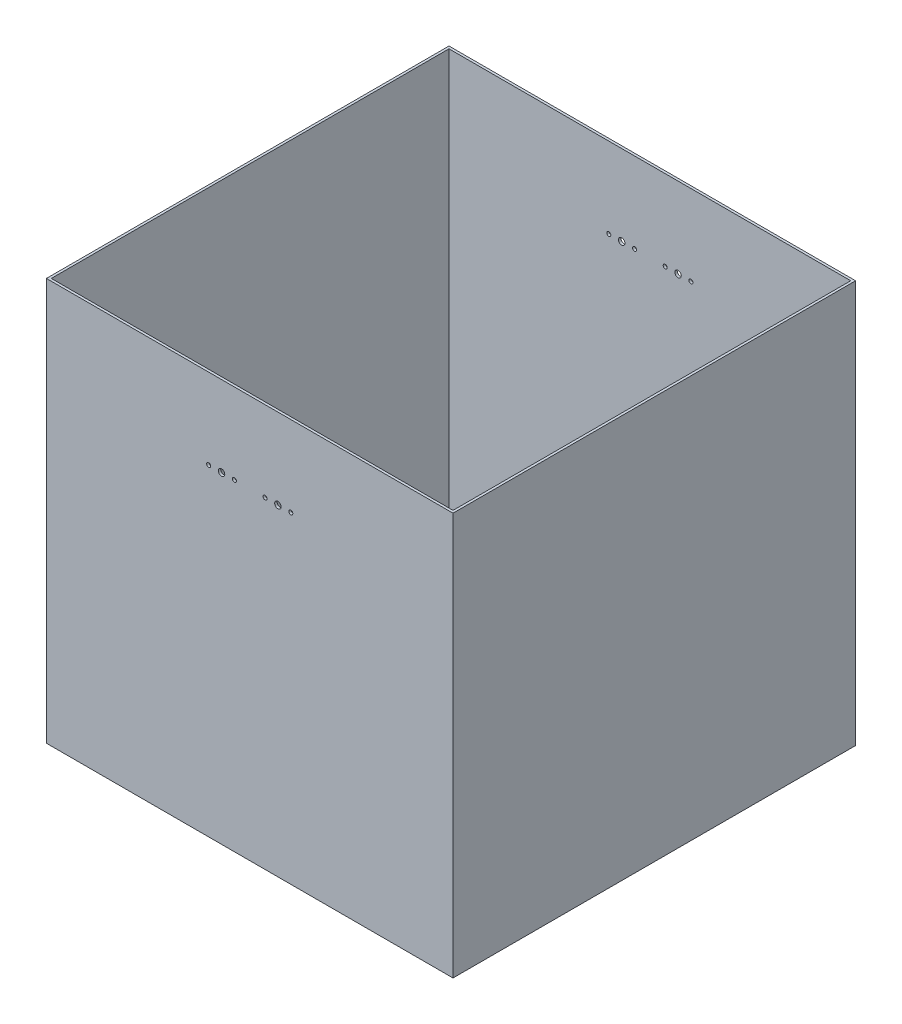
ISO-10303-21;
HEADER;
FILE_DESCRIPTION(('STEP AP214'),'2;1');
FILE_NAME('part.step','',(''),(''),'','','');
FILE_SCHEMA(('AUTOMOTIVE_DESIGN { 1 0 10303 214 1 1 1 1 }'));
ENDSEC;
DATA;
#1=APPLICATION_CONTEXT('core data for automotive mechanical design processes');
#2=APPLICATION_PROTOCOL_DEFINITION('international standard','automotive_design',2000,#1);
#3=PRODUCT_CONTEXT('',#1,'mechanical');
#4=PRODUCT('Part','Part','',(#3));
#5=PRODUCT_RELATED_PRODUCT_CATEGORY('part','',(#4));
#6=PRODUCT_DEFINITION_FORMATION('','',#4);
#7=PRODUCT_DEFINITION_CONTEXT('part definition',#1,'design');
#8=PRODUCT_DEFINITION('design','',#6,#7);
#9=PRODUCT_DEFINITION_SHAPE('','',#8);
#10=(LENGTH_UNIT() NAMED_UNIT(*) SI_UNIT(.MILLI.,.METRE.));
#11=(NAMED_UNIT(*) PLANE_ANGLE_UNIT() SI_UNIT($,.RADIAN.));
#12=(NAMED_UNIT(*) SI_UNIT($,.STERADIAN.) SOLID_ANGLE_UNIT());
#13=UNCERTAINTY_MEASURE_WITH_UNIT(LENGTH_MEASURE(1.E-05),#10,'distance_accuracy_value','');
#14=(GEOMETRIC_REPRESENTATION_CONTEXT(3) GLOBAL_UNCERTAINTY_ASSIGNED_CONTEXT((#13)) GLOBAL_UNIT_ASSIGNED_CONTEXT((#10,
#11,#12)) REPRESENTATION_CONTEXT('',''));
#15=CARTESIAN_POINT('',(0.,0.,0.));
#16=DIRECTION('',(0.,0.,1.));
#17=DIRECTION('',(1.,0.,0.));
#18=AXIS2_PLACEMENT_3D('',#15,#16,#17);
#19=CARTESIAN_POINT('',(0.,500.,0.));
#20=DIRECTION('',(0.,1.,0.));
#21=DIRECTION('',(0.,0.,1.));
#22=AXIS2_PLACEMENT_3D('',#19,#20,#21);
#23=PLANE('',#22);
#24=DIRECTION('',(0.,0.,-1.));
#25=VECTOR('',#24,1.);
#26=CARTESIAN_POINT('',(252.5,500.,-250.));
#27=LINE('',#26,#25);
#28=CARTESIAN_POINT('',(252.5,500.,250.));
#29=VERTEX_POINT('',#28);
#30=CARTESIAN_POINT('',(252.5,500.,-250.));
#31=VERTEX_POINT('',#30);
#32=EDGE_CURVE('E157',#29,#31,#27,.T.);
#33=ORIENTED_EDGE('',*,*,#32,.T.);
#34=DIRECTION('',(-1.,0.,0.));
#35=VECTOR('',#34,1.);
#36=CARTESIAN_POINT('',(-252.5,500.,-250.));
#37=LINE('',#36,#35);
#38=CARTESIAN_POINT('',(-252.5,500.,-250.));
#39=VERTEX_POINT('',#38);
#40=EDGE_CURVE('E161',#31,#39,#37,.T.);
#41=ORIENTED_EDGE('',*,*,#40,.T.);
#42=DIRECTION('',(0.,0.,1.));
#43=VECTOR('',#42,1.);
#44=CARTESIAN_POINT('',(-252.5,500.,-250.));
#45=LINE('',#44,#43);
#46=CARTESIAN_POINT('',(-252.5,500.,250.));
#47=VERTEX_POINT('',#46);
#48=EDGE_CURVE('E165',#39,#47,#45,.T.);
#49=ORIENTED_EDGE('',*,*,#48,.T.);
#50=DIRECTION('',(1.,0.,0.));
#51=VECTOR('',#50,1.);
#52=CARTESIAN_POINT('',(-252.5,500.,250.));
#53=LINE('',#52,#51);
#54=EDGE_CURVE('E168',#47,#29,#53,.T.);
#55=ORIENTED_EDGE('',*,*,#54,.T.);
#56=EDGE_LOOP('',(#33,#41,#49,#55));
#57=FACE_BOUND('',#56,.T.);
#58=DIRECTION('',(1.,0.,0.));
#59=VECTOR('',#58,1.);
#60=CARTESIAN_POINT('',(-249.5,500.,247.));
#61=LINE('',#60,#59);
#62=CARTESIAN_POINT('',(-249.5,500.,247.));
#63=VERTEX_POINT('',#62);
#64=CARTESIAN_POINT('',(249.5,500.,247.));
#65=VERTEX_POINT('',#64);
#66=EDGE_CURVE('E116',#63,#65,#61,.T.);
#67=ORIENTED_EDGE('',*,*,#66,.F.);
#68=DIRECTION('',(0.,0.,1.));
#69=VECTOR('',#68,1.);
#70=CARTESIAN_POINT('',(-249.5,500.,-247.));
#71=LINE('',#70,#69);
#72=CARTESIAN_POINT('',(-249.5,500.,-247.));
#73=VERTEX_POINT('',#72);
#74=EDGE_CURVE('E107',#73,#63,#71,.T.);
#75=ORIENTED_EDGE('',*,*,#74,.F.);
#76=DIRECTION('',(-1.,0.,0.));
#77=VECTOR('',#76,1.);
#78=CARTESIAN_POINT('',(-249.5,500.,-247.));
#79=LINE('',#78,#77);
#80=CARTESIAN_POINT('',(249.5,500.,-247.));
#81=VERTEX_POINT('',#80);
#82=EDGE_CURVE('E133',#81,#73,#79,.T.);
#83=ORIENTED_EDGE('',*,*,#82,.F.);
#84=DIRECTION('',(0.,0.,-1.));
#85=VECTOR('',#84,1.);
#86=CARTESIAN_POINT('',(249.5,500.,-247.));
#87=LINE('',#86,#85);
#88=EDGE_CURVE('E129',#65,#81,#87,.T.);
#89=ORIENTED_EDGE('',*,*,#88,.F.);
#90=EDGE_LOOP('',(#67,#75,#83,#89));
#91=FACE_BOUND('',#90,.T.);
#92=ADVANCED_FACE('F39',(#57,#91),#23,.T.);
#93=CARTESIAN_POINT('',(0.,0.,0.));
#94=DIRECTION('',(0.,1.,0.));
#95=DIRECTION('',(0.,0.,1.));
#96=AXIS2_PLACEMENT_3D('',#93,#94,#95);
#97=PLANE('',#96);
#98=DIRECTION('',(0.,0.,-1.));
#99=VECTOR('',#98,1.);
#100=CARTESIAN_POINT('',(252.5,0.,-250.));
#101=LINE('',#100,#99);
#102=CARTESIAN_POINT('',(252.5,0.,250.));
#103=VERTEX_POINT('',#102);
#104=CARTESIAN_POINT('',(252.5,0.,-250.));
#105=VERTEX_POINT('',#104);
#106=EDGE_CURVE('E125',#103,#105,#101,.T.);
#107=ORIENTED_EDGE('',*,*,#106,.F.);
#108=DIRECTION('',(1.,0.,0.));
#109=VECTOR('',#108,1.);
#110=CARTESIAN_POINT('',(-252.5,0.,250.));
#111=LINE('',#110,#109);
#112=CARTESIAN_POINT('',(-252.5,0.,250.));
#113=VERTEX_POINT('',#112);
#114=EDGE_CURVE('E162',#113,#103,#111,.T.);
#115=ORIENTED_EDGE('',*,*,#114,.F.);
#116=DIRECTION('',(0.,0.,1.));
#117=VECTOR('',#116,1.);
#118=CARTESIAN_POINT('',(-252.5,0.,-250.));
#119=LINE('',#118,#117);
#120=CARTESIAN_POINT('',(-252.5,0.,-250.));
#121=VERTEX_POINT('',#120);
#122=EDGE_CURVE('E178',#121,#113,#119,.T.);
#123=ORIENTED_EDGE('',*,*,#122,.F.);
#124=DIRECTION('',(-1.,0.,0.));
#125=VECTOR('',#124,1.);
#126=CARTESIAN_POINT('',(-252.5,0.,-250.));
#127=LINE('',#126,#125);
#128=EDGE_CURVE('E175',#105,#121,#127,.T.);
#129=ORIENTED_EDGE('',*,*,#128,.F.);
#130=EDGE_LOOP('',(#107,#115,#123,#129));
#131=FACE_BOUND('',#130,.T.);
#132=DIRECTION('',(0.,0.,1.));
#133=VECTOR('',#132,1.);
#134=CARTESIAN_POINT('',(-249.5,0.,-247.));
#135=LINE('',#134,#133);
#136=CARTESIAN_POINT('',(-249.5,0.,-247.));
#137=VERTEX_POINT('',#136);
#138=CARTESIAN_POINT('',(-249.5,0.,247.));
#139=VERTEX_POINT('',#138);
#140=EDGE_CURVE('E65',#137,#139,#135,.T.);
#141=ORIENTED_EDGE('',*,*,#140,.T.);
#142=DIRECTION('',(1.,0.,0.));
#143=VECTOR('',#142,1.);
#144=CARTESIAN_POINT('',(-249.5,0.,247.));
#145=LINE('',#144,#143);
#146=CARTESIAN_POINT('',(249.5,0.,247.));
#147=VERTEX_POINT('',#146);
#148=EDGE_CURVE('E123',#139,#147,#145,.T.);
#149=ORIENTED_EDGE('',*,*,#148,.T.);
#150=DIRECTION('',(0.,0.,-1.));
#151=VECTOR('',#150,1.);
#152=CARTESIAN_POINT('',(249.5,0.,-247.));
#153=LINE('',#152,#151);
#154=CARTESIAN_POINT('',(249.5,0.,-247.));
#155=VERTEX_POINT('',#154);
#156=EDGE_CURVE('E144',#147,#155,#153,.T.);
#157=ORIENTED_EDGE('',*,*,#156,.T.);
#158=DIRECTION('',(-1.,0.,0.));
#159=VECTOR('',#158,1.);
#160=CARTESIAN_POINT('',(-249.5,0.,-247.));
#161=LINE('',#160,#159);
#162=EDGE_CURVE('E117',#155,#137,#161,.T.);
#163=ORIENTED_EDGE('',*,*,#162,.T.);
#164=EDGE_LOOP('',(#141,#149,#157,#163));
#165=FACE_BOUND('',#164,.T.);
#166=ADVANCED_FACE('F256',(#131,#165),#97,.F.);
#167=CARTESIAN_POINT('',(252.5,500.,-250.));
#168=DIRECTION('',(-1.,0.,0.));
#169=DIRECTION('',(0.,0.,1.));
#170=AXIS2_PLACEMENT_3D('',#167,#168,#169);
#171=PLANE('',#170);
#172=ORIENTED_EDGE('',*,*,#106,.T.);
#173=DIRECTION('',(0.,-1.,0.));
#174=VECTOR('',#173,1.);
#175=CARTESIAN_POINT('',(252.5,500.,-250.));
#176=LINE('',#175,#174);
#177=EDGE_CURVE('E11',#31,#105,#176,.T.);
#178=ORIENTED_EDGE('',*,*,#177,.F.);
#179=ORIENTED_EDGE('',*,*,#32,.F.);
#180=DIRECTION('',(0.,-1.,0.));
#181=VECTOR('',#180,1.);
#182=CARTESIAN_POINT('',(252.5,500.,250.));
#183=LINE('',#182,#181);
#184=EDGE_CURVE('E171',#29,#103,#183,.T.);
#185=ORIENTED_EDGE('',*,*,#184,.T.);
#186=EDGE_LOOP('',(#172,#178,#179,#185));
#187=FACE_BOUND('',#186,.T.);
#188=ADVANCED_FACE('F41',(#187),#171,.F.);
#189=CARTESIAN_POINT('',(-252.5,500.,-250.));
#190=DIRECTION('',(0.,0.,1.));
#191=DIRECTION('',(1.,0.,0.));
#192=AXIS2_PLACEMENT_3D('',#189,#190,#191);
#193=PLANE('',#192);
#194=CARTESIAN_POINT('',(-51.,400.,-250.));
#195=DIRECTION('',(0.,0.,-1.));
#196=DIRECTION('',(-1.,0.,0.));
#197=AXIS2_PLACEMENT_3D('',#194,#195,#196);
#198=CIRCLE('',#197,2.5);
#199=CARTESIAN_POINT('',(-53.5,400.,-250.));
#200=VERTEX_POINT('',#199);
#201=EDGE_CURVE('E292',#200,#200,#198,.T.);
#202=ORIENTED_EDGE('',*,*,#201,.F.);
#203=EDGE_LOOP('',(#202));
#204=FACE_BOUND('',#203,.T.);
#205=CARTESIAN_POINT('',(35.,400.,-250.));
#206=DIRECTION('',(0.,0.,-1.));
#207=DIRECTION('',(1.,0.,0.));
#208=AXIS2_PLACEMENT_3D('',#205,#206,#207);
#209=CIRCLE('',#208,3.99999999999996);
#210=CARTESIAN_POINT('',(39.,400.,-250.));
#211=VERTEX_POINT('',#210);
#212=EDGE_CURVE('E296',#211,#211,#209,.T.);
#213=ORIENTED_EDGE('',*,*,#212,.F.);
#214=EDGE_LOOP('',(#213));
#215=FACE_BOUND('',#214,.T.);
#216=CARTESIAN_POINT('',(19.,400.,-250.));
#217=DIRECTION('',(0.,0.,-1.));
#218=DIRECTION('',(-1.,0.,0.));
#219=AXIS2_PLACEMENT_3D('',#216,#217,#218);
#220=CIRCLE('',#219,2.5);
#221=CARTESIAN_POINT('',(16.5,400.,-250.));
#222=VERTEX_POINT('',#221);
#223=EDGE_CURVE('E300',#222,#222,#220,.T.);
#224=ORIENTED_EDGE('',*,*,#223,.F.);
#225=EDGE_LOOP('',(#224));
#226=FACE_BOUND('',#225,.T.);
#227=CARTESIAN_POINT('',(51.,400.,-250.));
#228=DIRECTION('',(0.,0.,-1.));
#229=DIRECTION('',(1.,0.,0.));
#230=AXIS2_PLACEMENT_3D('',#227,#228,#229);
#231=CIRCLE('',#230,2.5);
#232=CARTESIAN_POINT('',(53.5,400.,-250.));
#233=VERTEX_POINT('',#232);
#234=EDGE_CURVE('E304',#233,#233,#231,.T.);
#235=ORIENTED_EDGE('',*,*,#234,.F.);
#236=EDGE_LOOP('',(#235));
#237=FACE_BOUND('',#236,.T.);
#238=CARTESIAN_POINT('',(-19.,400.,-250.));
#239=DIRECTION('',(0.,0.,-1.));
#240=DIRECTION('',(1.,0.,0.));
#241=AXIS2_PLACEMENT_3D('',#238,#239,#240);
#242=CIRCLE('',#241,2.5);
#243=CARTESIAN_POINT('',(-16.5,400.,-250.));
#244=VERTEX_POINT('',#243);
#245=EDGE_CURVE('E308',#244,#244,#242,.T.);
#246=ORIENTED_EDGE('',*,*,#245,.F.);
#247=EDGE_LOOP('',(#246));
#248=FACE_BOUND('',#247,.T.);
#249=CARTESIAN_POINT('',(-35.,400.,-250.));
#250=DIRECTION('',(0.,0.,-1.));
#251=DIRECTION('',(-1.,0.,0.));
#252=AXIS2_PLACEMENT_3D('',#249,#250,#251);
#253=CIRCLE('',#252,4.00000000000001);
#254=CARTESIAN_POINT('',(-39.,400.,-250.));
#255=VERTEX_POINT('',#254);
#256=EDGE_CURVE('E312',#255,#255,#253,.T.);
#257=ORIENTED_EDGE('',*,*,#256,.F.);
#258=EDGE_LOOP('',(#257));
#259=FACE_BOUND('',#258,.T.);
#260=ORIENTED_EDGE('',*,*,#128,.T.);
#261=DIRECTION('',(0.,-1.,0.));
#262=VECTOR('',#261,1.);
#263=CARTESIAN_POINT('',(-252.5,500.,-250.));
#264=LINE('',#263,#262);
#265=EDGE_CURVE('E49',#39,#121,#264,.T.);
#266=ORIENTED_EDGE('',*,*,#265,.F.);
#267=ORIENTED_EDGE('',*,*,#40,.F.);
#268=ORIENTED_EDGE('',*,*,#177,.T.);
#269=EDGE_LOOP('',(#260,#266,#267,#268));
#270=FACE_BOUND('',#269,.T.);
#271=ADVANCED_FACE('F281',(#204,#215,#226,#237,#248,#259,#270),#193,.F.);
#272=CARTESIAN_POINT('',(-252.5,500.,-250.));
#273=DIRECTION('',(1.,0.,0.));
#274=DIRECTION('',(0.,0.,-1.));
#275=AXIS2_PLACEMENT_3D('',#272,#273,#274);
#276=PLANE('',#275);
#277=ORIENTED_EDGE('',*,*,#122,.T.);
#278=DIRECTION('',(0.,-1.,0.));
#279=VECTOR('',#278,1.);
#280=CARTESIAN_POINT('',(-252.5,500.,250.));
#281=LINE('',#280,#279);
#282=EDGE_CURVE('E186',#47,#113,#281,.T.);
#283=ORIENTED_EDGE('',*,*,#282,.F.);
#284=ORIENTED_EDGE('',*,*,#48,.F.);
#285=ORIENTED_EDGE('',*,*,#265,.T.);
#286=EDGE_LOOP('',(#277,#283,#284,#285));
#287=FACE_BOUND('',#286,.T.);
#288=ADVANCED_FACE('F278',(#287),#276,.F.);
#289=CARTESIAN_POINT('',(-252.5,500.,250.));
#290=DIRECTION('',(0.,0.,-1.));
#291=DIRECTION('',(-1.,0.,0.));
#292=AXIS2_PLACEMENT_3D('',#289,#290,#291);
#293=PLANE('',#292);
#294=CARTESIAN_POINT('',(-51.,400.,250.));
#295=DIRECTION('',(0.,0.,-1.));
#296=DIRECTION('',(-1.,0.,0.));
#297=AXIS2_PLACEMENT_3D('',#294,#295,#296);
#298=CIRCLE('',#297,2.5);
#299=CARTESIAN_POINT('',(-53.5,400.,250.));
#300=VERTEX_POINT('',#299);
#301=EDGE_CURVE('E408',#300,#300,#298,.T.);
#302=ORIENTED_EDGE('',*,*,#301,.T.);
#303=EDGE_LOOP('',(#302));
#304=FACE_BOUND('',#303,.T.);
#305=CARTESIAN_POINT('',(35.,400.,250.));
#306=DIRECTION('',(0.,0.,-1.));
#307=DIRECTION('',(1.,0.,0.));
#308=AXIS2_PLACEMENT_3D('',#305,#306,#307);
#309=CIRCLE('',#308,3.99999999999996);
#310=CARTESIAN_POINT('',(39.,400.,250.));
#311=VERTEX_POINT('',#310);
#312=EDGE_CURVE('E326',#311,#311,#309,.T.);
#313=ORIENTED_EDGE('',*,*,#312,.T.);
#314=EDGE_LOOP('',(#313));
#315=FACE_BOUND('',#314,.T.);
#316=CARTESIAN_POINT('',(19.,400.,250.));
#317=DIRECTION('',(0.,0.,-1.));
#318=DIRECTION('',(-1.,0.,0.));
#319=AXIS2_PLACEMENT_3D('',#316,#317,#318);
#320=CIRCLE('',#319,2.5);
#321=CARTESIAN_POINT('',(16.5,400.,250.));
#322=VERTEX_POINT('',#321);
#323=EDGE_CURVE('E398',#322,#322,#320,.T.);
#324=ORIENTED_EDGE('',*,*,#323,.T.);
#325=EDGE_LOOP('',(#324));
#326=FACE_BOUND('',#325,.T.);
#327=CARTESIAN_POINT('',(51.,400.,250.));
#328=DIRECTION('',(0.,0.,-1.));
#329=DIRECTION('',(1.,0.,0.));
#330=AXIS2_PLACEMENT_3D('',#327,#328,#329);
#331=CIRCLE('',#330,2.5);
#332=CARTESIAN_POINT('',(53.5,400.,250.));
#333=VERTEX_POINT('',#332);
#334=EDGE_CURVE('E405',#333,#333,#331,.T.);
#335=ORIENTED_EDGE('',*,*,#334,.T.);
#336=EDGE_LOOP('',(#335));
#337=FACE_BOUND('',#336,.T.);
#338=CARTESIAN_POINT('',(-19.,400.,250.));
#339=DIRECTION('',(0.,0.,-1.));
#340=DIRECTION('',(1.,0.,0.));
#341=AXIS2_PLACEMENT_3D('',#338,#339,#340);
#342=CIRCLE('',#341,2.5);
#343=CARTESIAN_POINT('',(-16.5,400.,250.));
#344=VERTEX_POINT('',#343);
#345=EDGE_CURVE('E414',#344,#344,#342,.T.);
#346=ORIENTED_EDGE('',*,*,#345,.T.);
#347=EDGE_LOOP('',(#346));
#348=FACE_BOUND('',#347,.T.);
#349=CARTESIAN_POINT('',(-35.,400.,250.));
#350=DIRECTION('',(0.,0.,-1.));
#351=DIRECTION('',(-1.,0.,0.));
#352=AXIS2_PLACEMENT_3D('',#349,#350,#351);
#353=CIRCLE('',#352,4.00000000000001);
#354=CARTESIAN_POINT('',(-39.,400.,250.));
#355=VERTEX_POINT('',#354);
#356=EDGE_CURVE('E198',#355,#355,#353,.T.);
#357=ORIENTED_EDGE('',*,*,#356,.T.);
#358=EDGE_LOOP('',(#357));
#359=FACE_BOUND('',#358,.T.);
#360=ORIENTED_EDGE('',*,*,#114,.T.);
#361=ORIENTED_EDGE('',*,*,#184,.F.);
#362=ORIENTED_EDGE('',*,*,#54,.F.);
#363=ORIENTED_EDGE('',*,*,#282,.T.);
#364=EDGE_LOOP('',(#360,#361,#362,#363));
#365=FACE_BOUND('',#364,.T.);
#366=ADVANCED_FACE('F275',(#304,#315,#326,#337,#348,#359,#365),#293,.F.);
#367=CARTESIAN_POINT('',(-249.5,500.,-247.));
#368=DIRECTION('',(1.,0.,0.));
#369=DIRECTION('',(0.,0.,-1.));
#370=AXIS2_PLACEMENT_3D('',#367,#368,#369);
#371=PLANE('',#370);
#372=ORIENTED_EDGE('',*,*,#140,.F.);
#373=DIRECTION('',(0.,-1.,0.));
#374=VECTOR('',#373,1.);
#375=CARTESIAN_POINT('',(-249.5,500.,-247.));
#376=LINE('',#375,#374);
#377=EDGE_CURVE('E111',#73,#137,#376,.T.);
#378=ORIENTED_EDGE('',*,*,#377,.F.);
#379=ORIENTED_EDGE('',*,*,#74,.T.);
#380=DIRECTION('',(0.,-1.,0.));
#381=VECTOR('',#380,1.);
#382=CARTESIAN_POINT('',(-249.5,500.,247.));
#383=LINE('',#382,#381);
#384=EDGE_CURVE('E110',#63,#139,#383,.T.);
#385=ORIENTED_EDGE('',*,*,#384,.T.);
#386=EDGE_LOOP('',(#372,#378,#379,#385));
#387=FACE_BOUND('',#386,.T.);
#388=ADVANCED_FACE('F109',(#387),#371,.T.);
#389=CARTESIAN_POINT('',(-249.5,500.,247.));
#390=DIRECTION('',(0.,0.,-1.));
#391=DIRECTION('',(-1.,0.,0.));
#392=AXIS2_PLACEMENT_3D('',#389,#390,#391);
#393=PLANE('',#392);
#394=CARTESIAN_POINT('',(-51.,400.,247.));
#395=DIRECTION('',(0.,0.,-1.));
#396=DIRECTION('',(-1.,0.,0.));
#397=AXIS2_PLACEMENT_3D('',#394,#395,#396);
#398=CIRCLE('',#397,2.5);
#399=CARTESIAN_POINT('',(-53.5,400.,247.));
#400=VERTEX_POINT('',#399);
#401=EDGE_CURVE('E141',#400,#400,#398,.T.);
#402=ORIENTED_EDGE('',*,*,#401,.F.);
#403=EDGE_LOOP('',(#402));
#404=FACE_BOUND('',#403,.T.);
#405=CARTESIAN_POINT('',(35.,400.,247.));
#406=DIRECTION('',(0.,0.,-1.));
#407=DIRECTION('',(-1.,0.,0.));
#408=AXIS2_PLACEMENT_3D('',#405,#406,#407);
#409=CIRCLE('',#408,3.99999999999996);
#410=CARTESIAN_POINT('',(31.,400.,247.));
#411=VERTEX_POINT('',#410);
#412=EDGE_CURVE('E216',#411,#411,#409,.T.);
#413=ORIENTED_EDGE('',*,*,#412,.F.);
#414=EDGE_LOOP('',(#413));
#415=FACE_BOUND('',#414,.T.);
#416=CARTESIAN_POINT('',(19.,400.,247.));
#417=DIRECTION('',(0.,0.,-1.));
#418=DIRECTION('',(-1.,0.,0.));
#419=AXIS2_PLACEMENT_3D('',#416,#417,#418);
#420=CIRCLE('',#419,2.5);
#421=CARTESIAN_POINT('',(16.5,400.,247.));
#422=VERTEX_POINT('',#421);
#423=EDGE_CURVE('E212',#422,#422,#420,.T.);
#424=ORIENTED_EDGE('',*,*,#423,.F.);
#425=EDGE_LOOP('',(#424));
#426=FACE_BOUND('',#425,.T.);
#427=CARTESIAN_POINT('',(51.,400.,247.));
#428=DIRECTION('',(0.,0.,-1.));
#429=DIRECTION('',(-1.,0.,0.));
#430=AXIS2_PLACEMENT_3D('',#427,#428,#429);
#431=CIRCLE('',#430,2.5);
#432=CARTESIAN_POINT('',(48.5,400.,247.));
#433=VERTEX_POINT('',#432);
#434=EDGE_CURVE('E208',#433,#433,#431,.T.);
#435=ORIENTED_EDGE('',*,*,#434,.F.);
#436=EDGE_LOOP('',(#435));
#437=FACE_BOUND('',#436,.T.);
#438=CARTESIAN_POINT('',(-19.,400.,247.));
#439=DIRECTION('',(0.,0.,-1.));
#440=DIRECTION('',(-1.,0.,0.));
#441=AXIS2_PLACEMENT_3D('',#438,#439,#440);
#442=CIRCLE('',#441,2.5);
#443=CARTESIAN_POINT('',(-21.5,400.,247.));
#444=VERTEX_POINT('',#443);
#445=EDGE_CURVE('E203',#444,#444,#442,.T.);
#446=ORIENTED_EDGE('',*,*,#445,.F.);
#447=EDGE_LOOP('',(#446));
#448=FACE_BOUND('',#447,.T.);
#449=CARTESIAN_POINT('',(-35.,400.,247.));
#450=DIRECTION('',(0.,0.,-1.));
#451=DIRECTION('',(-1.,0.,0.));
#452=AXIS2_PLACEMENT_3D('',#449,#450,#451);
#453=CIRCLE('',#452,4.00000000000001);
#454=CARTESIAN_POINT('',(-39.,400.,247.));
#455=VERTEX_POINT('',#454);
#456=EDGE_CURVE('E197',#455,#455,#453,.T.);
#457=ORIENTED_EDGE('',*,*,#456,.F.);
#458=EDGE_LOOP('',(#457));
#459=FACE_BOUND('',#458,.T.);
#460=ORIENTED_EDGE('',*,*,#148,.F.);
#461=ORIENTED_EDGE('',*,*,#384,.F.);
#462=ORIENTED_EDGE('',*,*,#66,.T.);
#463=DIRECTION('',(0.,-1.,0.));
#464=VECTOR('',#463,1.);
#465=CARTESIAN_POINT('',(249.5,500.,247.));
#466=LINE('',#465,#464);
#467=EDGE_CURVE('E126',#65,#147,#466,.T.);
#468=ORIENTED_EDGE('',*,*,#467,.T.);
#469=EDGE_LOOP('',(#460,#461,#462,#468));
#470=FACE_BOUND('',#469,.T.);
#471=ADVANCED_FACE('F120',(#404,#415,#426,#437,#448,#459,#470),#393,.T.);
#472=CARTESIAN_POINT('',(249.5,500.,-247.));
#473=DIRECTION('',(-1.,0.,0.));
#474=DIRECTION('',(0.,0.,1.));
#475=AXIS2_PLACEMENT_3D('',#472,#473,#474);
#476=PLANE('',#475);
#477=ORIENTED_EDGE('',*,*,#156,.F.);
#478=ORIENTED_EDGE('',*,*,#467,.F.);
#479=ORIENTED_EDGE('',*,*,#88,.T.);
#480=DIRECTION('',(0.,-1.,0.));
#481=VECTOR('',#480,1.);
#482=CARTESIAN_POINT('',(249.5,500.,-247.));
#483=LINE('',#482,#481);
#484=EDGE_CURVE('E57',#81,#155,#483,.T.);
#485=ORIENTED_EDGE('',*,*,#484,.T.);
#486=EDGE_LOOP('',(#477,#478,#479,#485));
#487=FACE_BOUND('',#486,.T.);
#488=ADVANCED_FACE('F244',(#487),#476,.T.);
#489=CARTESIAN_POINT('',(-249.5,500.,-247.));
#490=DIRECTION('',(0.,0.,1.));
#491=DIRECTION('',(1.,0.,0.));
#492=AXIS2_PLACEMENT_3D('',#489,#490,#491);
#493=PLANE('',#492);
#494=CARTESIAN_POINT('',(-51.,400.,-247.));
#495=DIRECTION('',(0.,0.,1.));
#496=DIRECTION('',(1.,0.,0.));
#497=AXIS2_PLACEMENT_3D('',#494,#495,#496);
#498=CIRCLE('',#497,2.5);
#499=CARTESIAN_POINT('',(-48.5,400.,-247.));
#500=VERTEX_POINT('',#499);
#501=EDGE_CURVE('E43',#500,#500,#498,.T.);
#502=ORIENTED_EDGE('',*,*,#501,.F.);
#503=EDGE_LOOP('',(#502));
#504=FACE_BOUND('',#503,.T.);
#505=CARTESIAN_POINT('',(35.,400.,-247.));
#506=DIRECTION('',(0.,0.,1.));
#507=DIRECTION('',(1.,0.,0.));
#508=AXIS2_PLACEMENT_3D('',#505,#506,#507);
#509=CIRCLE('',#508,3.99999999999996);
#510=CARTESIAN_POINT('',(39.,400.,-247.));
#511=VERTEX_POINT('',#510);
#512=EDGE_CURVE('E213',#511,#511,#509,.T.);
#513=ORIENTED_EDGE('',*,*,#512,.F.);
#514=EDGE_LOOP('',(#513));
#515=FACE_BOUND('',#514,.T.);
#516=CARTESIAN_POINT('',(19.,400.,-247.));
#517=DIRECTION('',(0.,0.,1.));
#518=DIRECTION('',(1.,0.,0.));
#519=AXIS2_PLACEMENT_3D('',#516,#517,#518);
#520=CIRCLE('',#519,2.5);
#521=CARTESIAN_POINT('',(21.5,400.,-247.));
#522=VERTEX_POINT('',#521);
#523=EDGE_CURVE('E209',#522,#522,#520,.T.);
#524=ORIENTED_EDGE('',*,*,#523,.F.);
#525=EDGE_LOOP('',(#524));
#526=FACE_BOUND('',#525,.T.);
#527=CARTESIAN_POINT('',(51.,400.,-247.));
#528=DIRECTION('',(0.,0.,1.));
#529=DIRECTION('',(1.,0.,0.));
#530=AXIS2_PLACEMENT_3D('',#527,#528,#529);
#531=CIRCLE('',#530,2.5);
#532=CARTESIAN_POINT('',(53.5,400.,-247.));
#533=VERTEX_POINT('',#532);
#534=EDGE_CURVE('E204',#533,#533,#531,.T.);
#535=ORIENTED_EDGE('',*,*,#534,.F.);
#536=EDGE_LOOP('',(#535));
#537=FACE_BOUND('',#536,.T.);
#538=CARTESIAN_POINT('',(-19.,400.,-247.));
#539=DIRECTION('',(0.,0.,1.));
#540=DIRECTION('',(1.,0.,0.));
#541=AXIS2_PLACEMENT_3D('',#538,#539,#540);
#542=CIRCLE('',#541,2.5);
#543=CARTESIAN_POINT('',(-16.5,400.,-247.));
#544=VERTEX_POINT('',#543);
#545=EDGE_CURVE('E199',#544,#544,#542,.T.);
#546=ORIENTED_EDGE('',*,*,#545,.F.);
#547=EDGE_LOOP('',(#546));
#548=FACE_BOUND('',#547,.T.);
#549=CARTESIAN_POINT('',(-35.,400.,-247.));
#550=DIRECTION('',(0.,0.,1.));
#551=DIRECTION('',(1.,0.,0.));
#552=AXIS2_PLACEMENT_3D('',#549,#550,#551);
#553=CIRCLE('',#552,4.00000000000001);
#554=CARTESIAN_POINT('',(-31.,400.,-247.));
#555=VERTEX_POINT('',#554);
#556=EDGE_CURVE('E193',#555,#555,#553,.T.);
#557=ORIENTED_EDGE('',*,*,#556,.F.);
#558=EDGE_LOOP('',(#557));
#559=FACE_BOUND('',#558,.T.);
#560=ORIENTED_EDGE('',*,*,#162,.F.);
#561=ORIENTED_EDGE('',*,*,#484,.F.);
#562=ORIENTED_EDGE('',*,*,#82,.T.);
#563=ORIENTED_EDGE('',*,*,#377,.T.);
#564=EDGE_LOOP('',(#560,#561,#562,#563));
#565=FACE_BOUND('',#564,.T.);
#566=ADVANCED_FACE('F240',(#504,#515,#526,#537,#548,#559,#565),#493,.T.);
#567=CARTESIAN_POINT('',(-35.,400.,250.));
#568=DIRECTION('',(0.,0.,-1.));
#569=DIRECTION('',(-1.,0.,0.));
#570=AXIS2_PLACEMENT_3D('',#567,#568,#569);
#571=CYLINDRICAL_SURFACE('',#570,4.00000000000001);
#572=ORIENTED_EDGE('',*,*,#556,.T.);
#573=EDGE_LOOP('',(#572));
#574=FACE_BOUND('',#573,.T.);
#575=ORIENTED_EDGE('',*,*,#256,.T.);
#576=EDGE_LOOP('',(#575));
#577=FACE_BOUND('',#576,.T.);
#578=ADVANCED_FACE('F243',(#574,#577),#571,.F.);
#579=CARTESIAN_POINT('',(-19.,400.,250.));
#580=DIRECTION('',(0.,0.,-1.));
#581=DIRECTION('',(-1.,0.,0.));
#582=AXIS2_PLACEMENT_3D('',#579,#580,#581);
#583=CYLINDRICAL_SURFACE('',#582,2.5);
#584=ORIENTED_EDGE('',*,*,#545,.T.);
#585=EDGE_LOOP('',(#584));
#586=FACE_BOUND('',#585,.T.);
#587=ORIENTED_EDGE('',*,*,#245,.T.);
#588=EDGE_LOOP('',(#587));
#589=FACE_BOUND('',#588,.T.);
#590=ADVANCED_FACE('F360',(#586,#589),#583,.F.);
#591=CARTESIAN_POINT('',(51.,400.,250.));
#592=DIRECTION('',(0.,0.,-1.));
#593=DIRECTION('',(-1.,0.,0.));
#594=AXIS2_PLACEMENT_3D('',#591,#592,#593);
#595=CYLINDRICAL_SURFACE('',#594,2.5);
#596=ORIENTED_EDGE('',*,*,#534,.T.);
#597=EDGE_LOOP('',(#596));
#598=FACE_BOUND('',#597,.T.);
#599=ORIENTED_EDGE('',*,*,#234,.T.);
#600=EDGE_LOOP('',(#599));
#601=FACE_BOUND('',#600,.T.);
#602=ADVANCED_FACE('F369',(#598,#601),#595,.F.);
#603=CARTESIAN_POINT('',(19.,400.,250.));
#604=DIRECTION('',(0.,0.,-1.));
#605=DIRECTION('',(-1.,0.,0.));
#606=AXIS2_PLACEMENT_3D('',#603,#604,#605);
#607=CYLINDRICAL_SURFACE('',#606,2.5);
#608=ORIENTED_EDGE('',*,*,#523,.T.);
#609=EDGE_LOOP('',(#608));
#610=FACE_BOUND('',#609,.T.);
#611=ORIENTED_EDGE('',*,*,#223,.T.);
#612=EDGE_LOOP('',(#611));
#613=FACE_BOUND('',#612,.T.);
#614=ADVANCED_FACE('F374',(#610,#613),#607,.F.);
#615=CARTESIAN_POINT('',(35.,400.,250.));
#616=DIRECTION('',(0.,0.,-1.));
#617=DIRECTION('',(-1.,0.,0.));
#618=AXIS2_PLACEMENT_3D('',#615,#616,#617);
#619=CYLINDRICAL_SURFACE('',#618,3.99999999999996);
#620=ORIENTED_EDGE('',*,*,#512,.T.);
#621=EDGE_LOOP('',(#620));
#622=FACE_BOUND('',#621,.T.);
#623=ORIENTED_EDGE('',*,*,#212,.T.);
#624=EDGE_LOOP('',(#623));
#625=FACE_BOUND('',#624,.T.);
#626=ADVANCED_FACE('F361',(#622,#625),#619,.F.);
#627=CARTESIAN_POINT('',(-51.,400.,250.));
#628=DIRECTION('',(0.,0.,-1.));
#629=DIRECTION('',(-1.,0.,0.));
#630=AXIS2_PLACEMENT_3D('',#627,#628,#629);
#631=CYLINDRICAL_SURFACE('',#630,2.5);
#632=ORIENTED_EDGE('',*,*,#501,.T.);
#633=EDGE_LOOP('',(#632));
#634=FACE_BOUND('',#633,.T.);
#635=ORIENTED_EDGE('',*,*,#201,.T.);
#636=EDGE_LOOP('',(#635));
#637=FACE_BOUND('',#636,.T.);
#638=ADVANCED_FACE('F237',(#634,#637),#631,.F.);
#639=ORIENTED_EDGE('',*,*,#456,.T.);
#640=EDGE_LOOP('',(#639));
#641=FACE_BOUND('',#640,.T.);
#642=ORIENTED_EDGE('',*,*,#356,.F.);
#643=EDGE_LOOP('',(#642));
#644=FACE_BOUND('',#643,.T.);
#645=ADVANCED_FACE('F348',(#641,#644),#571,.F.);
#646=ORIENTED_EDGE('',*,*,#445,.T.);
#647=EDGE_LOOP('',(#646));
#648=FACE_BOUND('',#647,.T.);
#649=ORIENTED_EDGE('',*,*,#345,.F.);
#650=EDGE_LOOP('',(#649));
#651=FACE_BOUND('',#650,.T.);
#652=ADVANCED_FACE('F342',(#648,#651),#583,.F.);
#653=ORIENTED_EDGE('',*,*,#434,.T.);
#654=EDGE_LOOP('',(#653));
#655=FACE_BOUND('',#654,.T.);
#656=ORIENTED_EDGE('',*,*,#334,.F.);
#657=EDGE_LOOP('',(#656));
#658=FACE_BOUND('',#657,.T.);
#659=ADVANCED_FACE('F358',(#655,#658),#595,.F.);
#660=ORIENTED_EDGE('',*,*,#423,.T.);
#661=EDGE_LOOP('',(#660));
#662=FACE_BOUND('',#661,.T.);
#663=ORIENTED_EDGE('',*,*,#323,.F.);
#664=EDGE_LOOP('',(#663));
#665=FACE_BOUND('',#664,.T.);
#666=ADVANCED_FACE('F384',(#662,#665),#607,.F.);
#667=ORIENTED_EDGE('',*,*,#412,.T.);
#668=EDGE_LOOP('',(#667));
#669=FACE_BOUND('',#668,.T.);
#670=ORIENTED_EDGE('',*,*,#312,.F.);
#671=EDGE_LOOP('',(#670));
#672=FACE_BOUND('',#671,.T.);
#673=ADVANCED_FACE('F381',(#669,#672),#619,.F.);
#674=ORIENTED_EDGE('',*,*,#401,.T.);
#675=EDGE_LOOP('',(#674));
#676=FACE_BOUND('',#675,.T.);
#677=ORIENTED_EDGE('',*,*,#301,.F.);
#678=EDGE_LOOP('',(#677));
#679=FACE_BOUND('',#678,.T.);
#680=ADVANCED_FACE('F363',(#676,#679),#631,.F.);
#681=CLOSED_SHELL('',(#92,#166,#188,#271,#288,#366,#388,#471,#488,#566,#578,#590,#602,#614,#626,
#638,#645,#652,#659,#666,#673,#680));
#682=MANIFOLD_SOLID_BREP('B2',#681);
#683=ADVANCED_BREP_SHAPE_REPRESENTATION('',(#18,#682),#14);
#684=SHAPE_DEFINITION_REPRESENTATION(#9,#683);
ENDSEC;
END-ISO-10303-21;
